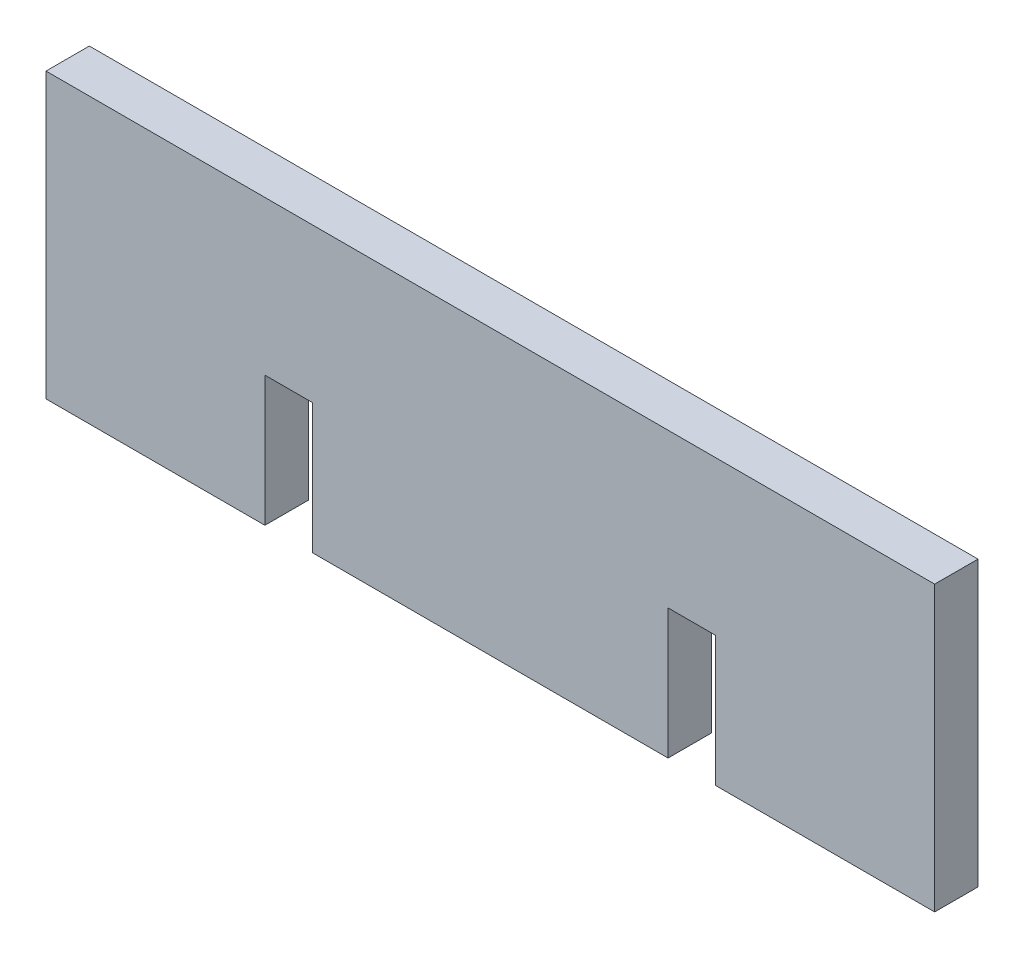
ISO-10303-21;
HEADER;
FILE_DESCRIPTION(('STEP AP214'),'2;1');
FILE_NAME('part.step','',(''),(''),'','','');
FILE_SCHEMA(('AUTOMOTIVE_DESIGN { 1 0 10303 214 1 1 1 1 }'));
ENDSEC;
DATA;
#1=APPLICATION_CONTEXT('core data for automotive mechanical design processes');
#2=APPLICATION_PROTOCOL_DEFINITION('international standard','automotive_design',2000,#1);
#3=PRODUCT_CONTEXT('',#1,'mechanical');
#4=PRODUCT('Part','Part','',(#3));
#5=PRODUCT_RELATED_PRODUCT_CATEGORY('part','',(#4));
#6=PRODUCT_DEFINITION_FORMATION('','',#4);
#7=PRODUCT_DEFINITION_CONTEXT('part definition',#1,'design');
#8=PRODUCT_DEFINITION('design','',#6,#7);
#9=PRODUCT_DEFINITION_SHAPE('','',#8);
#10=(LENGTH_UNIT() NAMED_UNIT(*) SI_UNIT(.MILLI.,.METRE.));
#11=(NAMED_UNIT(*) PLANE_ANGLE_UNIT() SI_UNIT($,.RADIAN.));
#12=(NAMED_UNIT(*) SI_UNIT($,.STERADIAN.) SOLID_ANGLE_UNIT());
#13=UNCERTAINTY_MEASURE_WITH_UNIT(LENGTH_MEASURE(1.E-05),#10,'distance_accuracy_value','');
#14=(GEOMETRIC_REPRESENTATION_CONTEXT(3) GLOBAL_UNCERTAINTY_ASSIGNED_CONTEXT((#13)) GLOBAL_UNIT_ASSIGNED_CONTEXT((#10,
#11,#12)) REPRESENTATION_CONTEXT('',''));
#15=CARTESIAN_POINT('',(0.,0.,0.));
#16=DIRECTION('',(0.,0.,1.));
#17=DIRECTION('',(1.,0.,0.));
#18=AXIS2_PLACEMENT_3D('',#15,#16,#17);
#19=CARTESIAN_POINT('',(52.,0.,10.));
#20=DIRECTION('',(1.,0.,0.));
#21=DIRECTION('',(0.,1.,0.));
#22=AXIS2_PLACEMENT_3D('',#19,#20,#21);
#23=PLANE('',#22);
#24=DIRECTION('',(0.,-1.,0.));
#25=VECTOR('',#24,1.);
#26=CARTESIAN_POINT('',(52.,0.,0.));
#27=LINE('',#26,#25);
#28=CARTESIAN_POINT('',(52.,-2.75000000000001,0.));
#29=VERTEX_POINT('',#28);
#30=CARTESIAN_POINT('',(52.,-32.75,0.));
#31=VERTEX_POINT('',#30);
#32=EDGE_CURVE('E156',#29,#31,#27,.T.);
#33=ORIENTED_EDGE('',*,*,#32,.T.);
#34=DIRECTION('',(0.,0.,-1.));
#35=VECTOR('',#34,1.);
#36=CARTESIAN_POINT('',(52.,-32.75,10.));
#37=LINE('',#36,#35);
#38=CARTESIAN_POINT('',(52.,-32.75,10.));
#39=VERTEX_POINT('',#38);
#40=EDGE_CURVE('E11',#39,#31,#37,.T.);
#41=ORIENTED_EDGE('',*,*,#40,.F.);
#42=DIRECTION('',(0.,-1.,0.));
#43=VECTOR('',#42,1.);
#44=CARTESIAN_POINT('',(52.,0.,10.));
#45=LINE('',#44,#43);
#46=CARTESIAN_POINT('',(52.,-2.75000000000001,10.));
#47=VERTEX_POINT('',#46);
#48=EDGE_CURVE('E185',#47,#39,#45,.T.);
#49=ORIENTED_EDGE('',*,*,#48,.F.);
#50=DIRECTION('',(0.,0.,-1.));
#51=VECTOR('',#50,1.);
#52=CARTESIAN_POINT('',(52.,-2.75000000000001,10.));
#53=LINE('',#52,#51);
#54=EDGE_CURVE('E152',#47,#29,#53,.T.);
#55=ORIENTED_EDGE('',*,*,#54,.T.);
#56=EDGE_LOOP('',(#33,#41,#49,#55));
#57=FACE_BOUND('',#56,.T.);
#58=ADVANCED_FACE('F36',(#57),#23,.F.);
#59=CARTESIAN_POINT('',(0.,-32.75,10.));
#60=DIRECTION('',(0.,1.,0.));
#61=DIRECTION('',(0.,0.,1.));
#62=AXIS2_PLACEMENT_3D('',#59,#60,#61);
#63=PLANE('',#62);
#64=DIRECTION('',(1.,0.,0.));
#65=VECTOR('',#64,1.);
#66=CARTESIAN_POINT('',(0.,-32.75,0.));
#67=LINE('',#66,#65);
#68=CARTESIAN_POINT('',(102.5,-32.75,0.));
#69=VERTEX_POINT('',#68);
#70=EDGE_CURVE('E159',#31,#69,#67,.T.);
#71=ORIENTED_EDGE('',*,*,#70,.T.);
#72=DIRECTION('',(0.,0.,-1.));
#73=VECTOR('',#72,1.);
#74=CARTESIAN_POINT('',(102.5,-32.75,10.));
#75=LINE('',#74,#73);
#76=CARTESIAN_POINT('',(102.5,-32.75,10.));
#77=VERTEX_POINT('',#76);
#78=EDGE_CURVE('E44',#77,#69,#75,.T.);
#79=ORIENTED_EDGE('',*,*,#78,.F.);
#80=DIRECTION('',(1.,0.,0.));
#81=VECTOR('',#80,1.);
#82=CARTESIAN_POINT('',(0.,-32.75,10.));
#83=LINE('',#82,#81);
#84=EDGE_CURVE('E107',#39,#77,#83,.T.);
#85=ORIENTED_EDGE('',*,*,#84,.F.);
#86=ORIENTED_EDGE('',*,*,#40,.T.);
#87=EDGE_LOOP('',(#71,#79,#85,#86));
#88=FACE_BOUND('',#87,.T.);
#89=ADVANCED_FACE('F207',(#88),#63,.F.);
#90=CARTESIAN_POINT('',(102.5,0.,10.));
#91=DIRECTION('',(1.,0.,0.));
#92=DIRECTION('',(0.,0.,-1.));
#93=AXIS2_PLACEMENT_3D('',#90,#91,#92);
#94=PLANE('',#93);
#95=DIRECTION('',(0.,-1.,0.));
#96=VECTOR('',#95,1.);
#97=CARTESIAN_POINT('',(102.5,0.,0.));
#98=LINE('',#97,#96);
#99=CARTESIAN_POINT('',(102.5,32.75,0.));
#100=VERTEX_POINT('',#99);
#101=EDGE_CURVE('E162',#100,#69,#98,.T.);
#102=ORIENTED_EDGE('',*,*,#101,.F.);
#103=DIRECTION('',(0.,0.,-1.));
#104=VECTOR('',#103,1.);
#105=CARTESIAN_POINT('',(102.5,32.75,10.));
#106=LINE('',#105,#104);
#107=CARTESIAN_POINT('',(102.5,32.75,10.));
#108=VERTEX_POINT('',#107);
#109=EDGE_CURVE('E200',#108,#100,#106,.T.);
#110=ORIENTED_EDGE('',*,*,#109,.F.);
#111=DIRECTION('',(0.,-1.,0.));
#112=VECTOR('',#111,1.);
#113=CARTESIAN_POINT('',(102.5,0.,10.));
#114=LINE('',#113,#112);
#115=EDGE_CURVE('E206',#108,#77,#114,.T.);
#116=ORIENTED_EDGE('',*,*,#115,.T.);
#117=ORIENTED_EDGE('',*,*,#78,.T.);
#118=EDGE_LOOP('',(#102,#110,#116,#117));
#119=FACE_BOUND('',#118,.T.);
#120=ADVANCED_FACE('F204',(#119),#94,.T.);
#121=CARTESIAN_POINT('',(0.,32.75,10.));
#122=DIRECTION('',(0.,1.,0.));
#123=DIRECTION('',(0.,0.,1.));
#124=AXIS2_PLACEMENT_3D('',#121,#122,#123);
#125=PLANE('',#124);
#126=DIRECTION('',(1.,0.,0.));
#127=VECTOR('',#126,1.);
#128=CARTESIAN_POINT('',(0.,32.75,0.));
#129=LINE('',#128,#127);
#130=CARTESIAN_POINT('',(-102.5,32.75,0.));
#131=VERTEX_POINT('',#130);
#132=EDGE_CURVE('E165',#131,#100,#129,.T.);
#133=ORIENTED_EDGE('',*,*,#132,.F.);
#134=DIRECTION('',(0.,0.,-1.));
#135=VECTOR('',#134,1.);
#136=CARTESIAN_POINT('',(-102.5,32.75,10.));
#137=LINE('',#136,#135);
#138=CARTESIAN_POINT('',(-102.5,32.75,10.));
#139=VERTEX_POINT('',#138);
#140=EDGE_CURVE('E198',#139,#131,#137,.T.);
#141=ORIENTED_EDGE('',*,*,#140,.F.);
#142=DIRECTION('',(1.,0.,0.));
#143=VECTOR('',#142,1.);
#144=CARTESIAN_POINT('',(0.,32.75,10.));
#145=LINE('',#144,#143);
#146=EDGE_CURVE('E220',#139,#108,#145,.T.);
#147=ORIENTED_EDGE('',*,*,#146,.T.);
#148=ORIENTED_EDGE('',*,*,#109,.T.);
#149=EDGE_LOOP('',(#133,#141,#147,#148));
#150=FACE_BOUND('',#149,.T.);
#151=ADVANCED_FACE('F216',(#150),#125,.T.);
#152=CARTESIAN_POINT('',(-102.5,0.,10.));
#153=DIRECTION('',(1.,0.,0.));
#154=DIRECTION('',(0.,1.,0.));
#155=AXIS2_PLACEMENT_3D('',#152,#153,#154);
#156=PLANE('',#155);
#157=DIRECTION('',(0.,-1.,0.));
#158=VECTOR('',#157,1.);
#159=CARTESIAN_POINT('',(-102.5,0.,0.));
#160=LINE('',#159,#158);
#161=CARTESIAN_POINT('',(-102.5,-32.75,0.));
#162=VERTEX_POINT('',#161);
#163=EDGE_CURVE('E168',#131,#162,#160,.T.);
#164=ORIENTED_EDGE('',*,*,#163,.T.);
#165=DIRECTION('',(0.,0.,-1.));
#166=VECTOR('',#165,1.);
#167=CARTESIAN_POINT('',(-102.5,-32.75,10.));
#168=LINE('',#167,#166);
#169=CARTESIAN_POINT('',(-102.5,-32.75,10.));
#170=VERTEX_POINT('',#169);
#171=EDGE_CURVE('E195',#170,#162,#168,.T.);
#172=ORIENTED_EDGE('',*,*,#171,.F.);
#173=DIRECTION('',(0.,-1.,0.));
#174=VECTOR('',#173,1.);
#175=CARTESIAN_POINT('',(-102.5,0.,10.));
#176=LINE('',#175,#174);
#177=EDGE_CURVE('E222',#139,#170,#176,.T.);
#178=ORIENTED_EDGE('',*,*,#177,.F.);
#179=ORIENTED_EDGE('',*,*,#140,.T.);
#180=EDGE_LOOP('',(#164,#172,#178,#179));
#181=FACE_BOUND('',#180,.T.);
#182=ADVANCED_FACE('F262',(#181),#156,.F.);
#183=CARTESIAN_POINT('',(0.,-32.75,10.));
#184=DIRECTION('',(0.,1.,0.));
#185=DIRECTION('',(0.,0.,1.));
#186=AXIS2_PLACEMENT_3D('',#183,#184,#185);
#187=PLANE('',#186);
#188=DIRECTION('',(1.,0.,0.));
#189=VECTOR('',#188,1.);
#190=CARTESIAN_POINT('',(0.,-32.75,0.));
#191=LINE('',#190,#189);
#192=CARTESIAN_POINT('',(-52.,-32.75,0.));
#193=VERTEX_POINT('',#192);
#194=EDGE_CURVE('E170',#162,#193,#191,.T.);
#195=ORIENTED_EDGE('',*,*,#194,.T.);
#196=DIRECTION('',(0.,0.,-1.));
#197=VECTOR('',#196,1.);
#198=CARTESIAN_POINT('',(-52.,-32.75,10.));
#199=LINE('',#198,#197);
#200=CARTESIAN_POINT('',(-52.,-32.75,10.));
#201=VERTEX_POINT('',#200);
#202=EDGE_CURVE('E193',#201,#193,#199,.T.);
#203=ORIENTED_EDGE('',*,*,#202,.F.);
#204=DIRECTION('',(1.,0.,0.));
#205=VECTOR('',#204,1.);
#206=CARTESIAN_POINT('',(0.,-32.75,10.));
#207=LINE('',#206,#205);
#208=EDGE_CURVE('E228',#170,#201,#207,.T.);
#209=ORIENTED_EDGE('',*,*,#208,.F.);
#210=ORIENTED_EDGE('',*,*,#171,.T.);
#211=EDGE_LOOP('',(#195,#203,#209,#210));
#212=FACE_BOUND('',#211,.T.);
#213=ADVANCED_FACE('F265',(#212),#187,.F.);
#214=CARTESIAN_POINT('',(-52.,0.,10.));
#215=DIRECTION('',(1.,0.,0.));
#216=DIRECTION('',(0.,1.,0.));
#217=AXIS2_PLACEMENT_3D('',#214,#215,#216);
#218=PLANE('',#217);
#219=DIRECTION('',(0.,-1.,0.));
#220=VECTOR('',#219,1.);
#221=CARTESIAN_POINT('',(-52.,0.,0.));
#222=LINE('',#221,#220);
#223=CARTESIAN_POINT('',(-52.,-2.75000000000001,0.));
#224=VERTEX_POINT('',#223);
#225=EDGE_CURVE('E173',#224,#193,#222,.T.);
#226=ORIENTED_EDGE('',*,*,#225,.F.);
#227=DIRECTION('',(0.,0.,-1.));
#228=VECTOR('',#227,1.);
#229=CARTESIAN_POINT('',(-52.,-2.75000000000001,10.));
#230=LINE('',#229,#228);
#231=CARTESIAN_POINT('',(-52.,-2.75000000000001,10.));
#232=VERTEX_POINT('',#231);
#233=EDGE_CURVE('E191',#232,#224,#230,.T.);
#234=ORIENTED_EDGE('',*,*,#233,.F.);
#235=DIRECTION('',(0.,-1.,0.));
#236=VECTOR('',#235,1.);
#237=CARTESIAN_POINT('',(-52.,0.,10.));
#238=LINE('',#237,#236);
#239=EDGE_CURVE('E230',#232,#201,#238,.T.);
#240=ORIENTED_EDGE('',*,*,#239,.T.);
#241=ORIENTED_EDGE('',*,*,#202,.T.);
#242=EDGE_LOOP('',(#226,#234,#240,#241));
#243=FACE_BOUND('',#242,.T.);
#244=ADVANCED_FACE('F269',(#243),#218,.T.);
#245=CARTESIAN_POINT('',(0.,-2.75,10.));
#246=DIRECTION('',(0.,-1.,0.));
#247=DIRECTION('',(1.,0.,0.));
#248=AXIS2_PLACEMENT_3D('',#245,#246,#247);
#249=PLANE('',#248);
#250=DIRECTION('',(-1.,0.,0.));
#251=VECTOR('',#250,1.);
#252=CARTESIAN_POINT('',(0.,-2.75,0.));
#253=LINE('',#252,#251);
#254=CARTESIAN_POINT('',(-41.,-2.75000000000001,0.));
#255=VERTEX_POINT('',#254);
#256=EDGE_CURVE('E176',#255,#224,#253,.T.);
#257=ORIENTED_EDGE('',*,*,#256,.F.);
#258=DIRECTION('',(0.,0.,-1.));
#259=VECTOR('',#258,1.);
#260=CARTESIAN_POINT('',(-41.,-2.75000000000001,10.));
#261=LINE('',#260,#259);
#262=CARTESIAN_POINT('',(-41.,-2.75000000000001,10.));
#263=VERTEX_POINT('',#262);
#264=EDGE_CURVE('E189',#263,#255,#261,.T.);
#265=ORIENTED_EDGE('',*,*,#264,.F.);
#266=DIRECTION('',(-1.,0.,0.));
#267=VECTOR('',#266,1.);
#268=CARTESIAN_POINT('',(0.,-2.75,10.));
#269=LINE('',#268,#267);
#270=EDGE_CURVE('E233',#263,#232,#269,.T.);
#271=ORIENTED_EDGE('',*,*,#270,.T.);
#272=ORIENTED_EDGE('',*,*,#233,.T.);
#273=EDGE_LOOP('',(#257,#265,#271,#272));
#274=FACE_BOUND('',#273,.T.);
#275=ADVANCED_FACE('F273',(#274),#249,.T.);
#276=CARTESIAN_POINT('',(-41.,0.,10.));
#277=DIRECTION('',(-1.,0.,0.));
#278=DIRECTION('',(0.,0.,1.));
#279=AXIS2_PLACEMENT_3D('',#276,#277,#278);
#280=PLANE('',#279);
#281=DIRECTION('',(0.,1.,0.));
#282=VECTOR('',#281,1.);
#283=CARTESIAN_POINT('',(-41.,0.,0.));
#284=LINE('',#283,#282);
#285=CARTESIAN_POINT('',(-41.,-32.75,0.));
#286=VERTEX_POINT('',#285);
#287=EDGE_CURVE('E179',#286,#255,#284,.T.);
#288=ORIENTED_EDGE('',*,*,#287,.F.);
#289=DIRECTION('',(0.,0.,-1.));
#290=VECTOR('',#289,1.);
#291=CARTESIAN_POINT('',(-41.,-32.75,10.));
#292=LINE('',#291,#290);
#293=CARTESIAN_POINT('',(-41.,-32.75,10.));
#294=VERTEX_POINT('',#293);
#295=EDGE_CURVE('E147',#294,#286,#292,.T.);
#296=ORIENTED_EDGE('',*,*,#295,.F.);
#297=DIRECTION('',(0.,1.,0.));
#298=VECTOR('',#297,1.);
#299=CARTESIAN_POINT('',(-41.,0.,10.));
#300=LINE('',#299,#298);
#301=EDGE_CURVE('E140',#294,#263,#300,.T.);
#302=ORIENTED_EDGE('',*,*,#301,.T.);
#303=ORIENTED_EDGE('',*,*,#264,.T.);
#304=EDGE_LOOP('',(#288,#296,#302,#303));
#305=FACE_BOUND('',#304,.T.);
#306=ADVANCED_FACE('F237',(#305),#280,.T.);
#307=CARTESIAN_POINT('',(0.,-32.75,10.));
#308=DIRECTION('',(0.,1.,0.));
#309=DIRECTION('',(0.,0.,1.));
#310=AXIS2_PLACEMENT_3D('',#307,#308,#309);
#311=PLANE('',#310);
#312=DIRECTION('',(1.,0.,0.));
#313=VECTOR('',#312,1.);
#314=CARTESIAN_POINT('',(0.,-32.75,0.));
#315=LINE('',#314,#313);
#316=CARTESIAN_POINT('',(41.,-32.75,0.));
#317=VERTEX_POINT('',#316);
#318=EDGE_CURVE('E146',#286,#317,#315,.T.);
#319=ORIENTED_EDGE('',*,*,#318,.T.);
#320=DIRECTION('',(0.,0.,-1.));
#321=VECTOR('',#320,1.);
#322=CARTESIAN_POINT('',(41.,-32.75,10.));
#323=LINE('',#322,#321);
#324=CARTESIAN_POINT('',(41.,-32.75,10.));
#325=VERTEX_POINT('',#324);
#326=EDGE_CURVE('E143',#325,#317,#323,.T.);
#327=ORIENTED_EDGE('',*,*,#326,.F.);
#328=DIRECTION('',(1.,0.,0.));
#329=VECTOR('',#328,1.);
#330=CARTESIAN_POINT('',(0.,-32.75,10.));
#331=LINE('',#330,#329);
#332=EDGE_CURVE('E133',#294,#325,#331,.T.);
#333=ORIENTED_EDGE('',*,*,#332,.F.);
#334=ORIENTED_EDGE('',*,*,#295,.T.);
#335=EDGE_LOOP('',(#319,#327,#333,#334));
#336=FACE_BOUND('',#335,.T.);
#337=ADVANCED_FACE('F144',(#336),#311,.F.);
#338=CARTESIAN_POINT('',(41.,0.,10.));
#339=DIRECTION('',(-1.,0.,0.));
#340=DIRECTION('',(0.,0.,1.));
#341=AXIS2_PLACEMENT_3D('',#338,#339,#340);
#342=PLANE('',#341);
#343=DIRECTION('',(0.,1.,0.));
#344=VECTOR('',#343,1.);
#345=CARTESIAN_POINT('',(41.,0.,0.));
#346=LINE('',#345,#344);
#347=CARTESIAN_POINT('',(41.,-2.75000000000001,0.));
#348=VERTEX_POINT('',#347);
#349=EDGE_CURVE('E93',#317,#348,#346,.T.);
#350=ORIENTED_EDGE('',*,*,#349,.T.);
#351=DIRECTION('',(0.,0.,-1.));
#352=VECTOR('',#351,1.);
#353=CARTESIAN_POINT('',(41.,-2.75000000000001,10.));
#354=LINE('',#353,#352);
#355=CARTESIAN_POINT('',(41.,-2.75000000000001,10.));
#356=VERTEX_POINT('',#355);
#357=EDGE_CURVE('E148',#356,#348,#354,.T.);
#358=ORIENTED_EDGE('',*,*,#357,.F.);
#359=DIRECTION('',(0.,1.,0.));
#360=VECTOR('',#359,1.);
#361=CARTESIAN_POINT('',(41.,0.,10.));
#362=LINE('',#361,#360);
#363=EDGE_CURVE('E137',#325,#356,#362,.T.);
#364=ORIENTED_EDGE('',*,*,#363,.F.);
#365=ORIENTED_EDGE('',*,*,#326,.T.);
#366=EDGE_LOOP('',(#350,#358,#364,#365));
#367=FACE_BOUND('',#366,.T.);
#368=ADVANCED_FACE('F150',(#367),#342,.F.);
#369=CARTESIAN_POINT('',(0.,-2.75000000000001,10.));
#370=DIRECTION('',(0.,1.,0.));
#371=DIRECTION('',(0.,0.,1.));
#372=AXIS2_PLACEMENT_3D('',#369,#370,#371);
#373=PLANE('',#372);
#374=DIRECTION('',(1.,0.,0.));
#375=VECTOR('',#374,1.);
#376=CARTESIAN_POINT('',(0.,-2.75000000000001,0.));
#377=LINE('',#376,#375);
#378=EDGE_CURVE('E99',#348,#29,#377,.T.);
#379=ORIENTED_EDGE('',*,*,#378,.T.);
#380=ORIENTED_EDGE('',*,*,#54,.F.);
#381=DIRECTION('',(1.,0.,0.));
#382=VECTOR('',#381,1.);
#383=CARTESIAN_POINT('',(0.,-2.75000000000001,10.));
#384=LINE('',#383,#382);
#385=EDGE_CURVE('E52',#356,#47,#384,.T.);
#386=ORIENTED_EDGE('',*,*,#385,.F.);
#387=ORIENTED_EDGE('',*,*,#357,.T.);
#388=EDGE_LOOP('',(#379,#380,#386,#387));
#389=FACE_BOUND('',#388,.T.);
#390=ADVANCED_FACE('F241',(#389),#373,.F.);
#391=CARTESIAN_POINT('',(0.,0.,10.));
#392=DIRECTION('',(0.,0.,1.));
#393=DIRECTION('',(1.,0.,0.));
#394=AXIS2_PLACEMENT_3D('',#391,#392,#393);
#395=PLANE('',#394);
#396=ORIENTED_EDGE('',*,*,#48,.T.);
#397=ORIENTED_EDGE('',*,*,#84,.T.);
#398=ORIENTED_EDGE('',*,*,#115,.F.);
#399=ORIENTED_EDGE('',*,*,#146,.F.);
#400=ORIENTED_EDGE('',*,*,#177,.T.);
#401=ORIENTED_EDGE('',*,*,#208,.T.);
#402=ORIENTED_EDGE('',*,*,#239,.F.);
#403=ORIENTED_EDGE('',*,*,#270,.F.);
#404=ORIENTED_EDGE('',*,*,#301,.F.);
#405=ORIENTED_EDGE('',*,*,#332,.T.);
#406=ORIENTED_EDGE('',*,*,#363,.T.);
#407=ORIENTED_EDGE('',*,*,#385,.T.);
#408=EDGE_LOOP('',(#396,#397,#398,#399,#400,#401,#402,#403,#404,#405,#406,#407));
#409=FACE_BOUND('',#408,.T.);
#410=ADVANCED_FACE('F135',(#409),#395,.T.);
#411=CARTESIAN_POINT('',(0.,0.,0.));
#412=DIRECTION('',(0.,0.,1.));
#413=DIRECTION('',(1.,0.,0.));
#414=AXIS2_PLACEMENT_3D('',#411,#412,#413);
#415=PLANE('',#414);
#416=ORIENTED_EDGE('',*,*,#32,.F.);
#417=ORIENTED_EDGE('',*,*,#378,.F.);
#418=ORIENTED_EDGE('',*,*,#349,.F.);
#419=ORIENTED_EDGE('',*,*,#318,.F.);
#420=ORIENTED_EDGE('',*,*,#287,.T.);
#421=ORIENTED_EDGE('',*,*,#256,.T.);
#422=ORIENTED_EDGE('',*,*,#225,.T.);
#423=ORIENTED_EDGE('',*,*,#194,.F.);
#424=ORIENTED_EDGE('',*,*,#163,.F.);
#425=ORIENTED_EDGE('',*,*,#132,.T.);
#426=ORIENTED_EDGE('',*,*,#101,.T.);
#427=ORIENTED_EDGE('',*,*,#70,.F.);
#428=EDGE_LOOP('',(#416,#417,#418,#419,#420,#421,#422,#423,#424,#425,#426,#427));
#429=FACE_BOUND('',#428,.T.);
#430=ADVANCED_FACE('F211',(#429),#415,.F.);
#431=CLOSED_SHELL('',(#58,#89,#120,#151,#182,#213,#244,#275,#306,#337,#368,#390,#410,#430));
#432=MANIFOLD_SOLID_BREP('B2',#431);
#433=ADVANCED_BREP_SHAPE_REPRESENTATION('',(#18,#432),#14);
#434=SHAPE_DEFINITION_REPRESENTATION(#9,#433);
ENDSEC;
END-ISO-10303-21;
